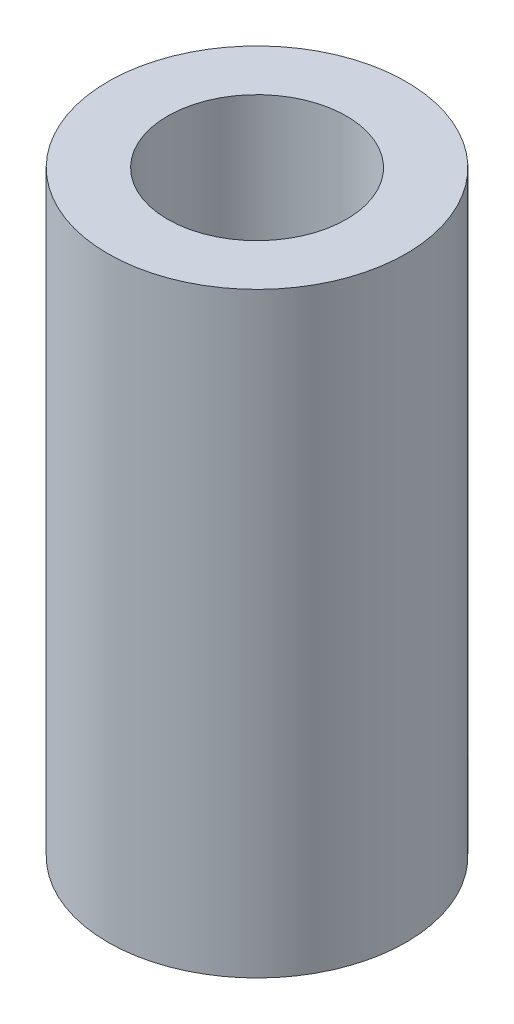
ISO-10303-21;
HEADER;
FILE_DESCRIPTION(('STEP AP214'),'2;1');
FILE_NAME('part.step','',(''),(''),'','','');
FILE_SCHEMA(('AUTOMOTIVE_DESIGN { 1 0 10303 214 1 1 1 1 }'));
ENDSEC;
DATA;
#1=APPLICATION_CONTEXT('core data for automotive mechanical design processes');
#2=APPLICATION_PROTOCOL_DEFINITION('international standard','automotive_design',2000,#1);
#3=PRODUCT_CONTEXT('',#1,'mechanical');
#4=PRODUCT('Part','Part','',(#3));
#5=PRODUCT_RELATED_PRODUCT_CATEGORY('part','',(#4));
#6=PRODUCT_DEFINITION_FORMATION('','',#4);
#7=PRODUCT_DEFINITION_CONTEXT('part definition',#1,'design');
#8=PRODUCT_DEFINITION('design','',#6,#7);
#9=PRODUCT_DEFINITION_SHAPE('','',#8);
#10=(LENGTH_UNIT() NAMED_UNIT(*) SI_UNIT(.MILLI.,.METRE.));
#11=(NAMED_UNIT(*) PLANE_ANGLE_UNIT() SI_UNIT($,.RADIAN.));
#12=(NAMED_UNIT(*) SI_UNIT($,.STERADIAN.) SOLID_ANGLE_UNIT());
#13=UNCERTAINTY_MEASURE_WITH_UNIT(LENGTH_MEASURE(1.E-05),#10,'distance_accuracy_value','');
#14=(GEOMETRIC_REPRESENTATION_CONTEXT(3) GLOBAL_UNCERTAINTY_ASSIGNED_CONTEXT((#13)) GLOBAL_UNIT_ASSIGNED_CONTEXT((#10,
#11,#12)) REPRESENTATION_CONTEXT('',''));
#15=CARTESIAN_POINT('',(0.,0.,0.));
#16=DIRECTION('',(0.,0.,1.));
#17=DIRECTION('',(1.,0.,0.));
#18=AXIS2_PLACEMENT_3D('',#15,#16,#17);
#19=CARTESIAN_POINT('',(0.,10.,0.));
#20=DIRECTION('',(0.,-1.,0.));
#21=DIRECTION('',(0.,0.,-1.));
#22=AXIS2_PLACEMENT_3D('',#19,#20,#21);
#23=CYLINDRICAL_SURFACE('',#22,2.5);
#24=CARTESIAN_POINT('',(0.,10.,0.));
#25=DIRECTION('',(0.,1.,0.));
#26=DIRECTION('',(0.,0.,1.));
#27=AXIS2_PLACEMENT_3D('',#24,#25,#26);
#28=CIRCLE('',#27,2.5);
#29=CARTESIAN_POINT('',(0.,10.,2.5));
#30=VERTEX_POINT('',#29);
#31=EDGE_CURVE('E10',#30,#30,#28,.T.);
#32=ORIENTED_EDGE('',*,*,#31,.F.);
#33=EDGE_LOOP('',(#32));
#34=FACE_BOUND('',#33,.T.);
#35=CARTESIAN_POINT('',(0.,0.,0.));
#36=DIRECTION('',(0.,1.,0.));
#37=DIRECTION('',(0.,0.,1.));
#38=AXIS2_PLACEMENT_3D('',#35,#36,#37);
#39=CIRCLE('',#38,2.5);
#40=CARTESIAN_POINT('',(0.,0.,2.5));
#41=VERTEX_POINT('',#40);
#42=EDGE_CURVE('E38',#41,#41,#39,.T.);
#43=ORIENTED_EDGE('',*,*,#42,.T.);
#44=EDGE_LOOP('',(#43));
#45=FACE_BOUND('',#44,.T.);
#46=ADVANCED_FACE('F31',(#34,#45),#23,.T.);
#47=CARTESIAN_POINT('',(0.,10.,0.));
#48=DIRECTION('',(0.,1.,0.));
#49=DIRECTION('',(0.,0.,1.));
#50=AXIS2_PLACEMENT_3D('',#47,#48,#49);
#51=PLANE('',#50);
#52=CARTESIAN_POINT('',(0.,10.,0.));
#53=DIRECTION('',(0.,1.,0.));
#54=DIRECTION('',(0.,0.,1.));
#55=AXIS2_PLACEMENT_3D('',#52,#53,#54);
#56=CIRCLE('',#55,1.5);
#57=CARTESIAN_POINT('',(0.,10.,1.5));
#58=VERTEX_POINT('',#57);
#59=EDGE_CURVE('E44',#58,#58,#56,.T.);
#60=ORIENTED_EDGE('',*,*,#59,.F.);
#61=EDGE_LOOP('',(#60));
#62=FACE_BOUND('',#61,.T.);
#63=ORIENTED_EDGE('',*,*,#31,.T.);
#64=EDGE_LOOP('',(#63));
#65=FACE_BOUND('',#64,.T.);
#66=ADVANCED_FACE('F61',(#62,#65),#51,.T.);
#67=CARTESIAN_POINT('',(0.,0.,0.));
#68=DIRECTION('',(0.,1.,0.));
#69=DIRECTION('',(0.,0.,1.));
#70=AXIS2_PLACEMENT_3D('',#67,#68,#69);
#71=PLANE('',#70);
#72=CARTESIAN_POINT('',(0.,0.,0.));
#73=DIRECTION('',(0.,1.,0.));
#74=DIRECTION('',(0.,0.,1.));
#75=AXIS2_PLACEMENT_3D('',#72,#73,#74);
#76=CIRCLE('',#75,1.5);
#77=CARTESIAN_POINT('',(0.,0.,1.5));
#78=VERTEX_POINT('',#77);
#79=EDGE_CURVE('E34',#78,#78,#76,.T.);
#80=ORIENTED_EDGE('',*,*,#79,.T.);
#81=EDGE_LOOP('',(#80));
#82=FACE_BOUND('',#81,.T.);
#83=ORIENTED_EDGE('',*,*,#42,.F.);
#84=EDGE_LOOP('',(#83));
#85=FACE_BOUND('',#84,.T.);
#86=ADVANCED_FACE('F51',(#82,#85),#71,.F.);
#87=CARTESIAN_POINT('',(0.,-6.,0.));
#88=DIRECTION('',(0.,1.,0.));
#89=DIRECTION('',(0.,0.,1.));
#90=AXIS2_PLACEMENT_3D('',#87,#88,#89);
#91=CYLINDRICAL_SURFACE('',#90,1.5);
#92=ORIENTED_EDGE('',*,*,#59,.T.);
#93=EDGE_LOOP('',(#92));
#94=FACE_BOUND('',#93,.T.);
#95=ORIENTED_EDGE('',*,*,#79,.F.);
#96=EDGE_LOOP('',(#95));
#97=FACE_BOUND('',#96,.T.);
#98=ADVANCED_FACE('F54',(#94,#97),#91,.F.);
#99=CLOSED_SHELL('',(#46,#66,#86,#98));
#100=MANIFOLD_SOLID_BREP('B2',#99);
#101=ADVANCED_BREP_SHAPE_REPRESENTATION('',(#18,#100),#14);
#102=SHAPE_DEFINITION_REPRESENTATION(#9,#101);
ENDSEC;
END-ISO-10303-21;
